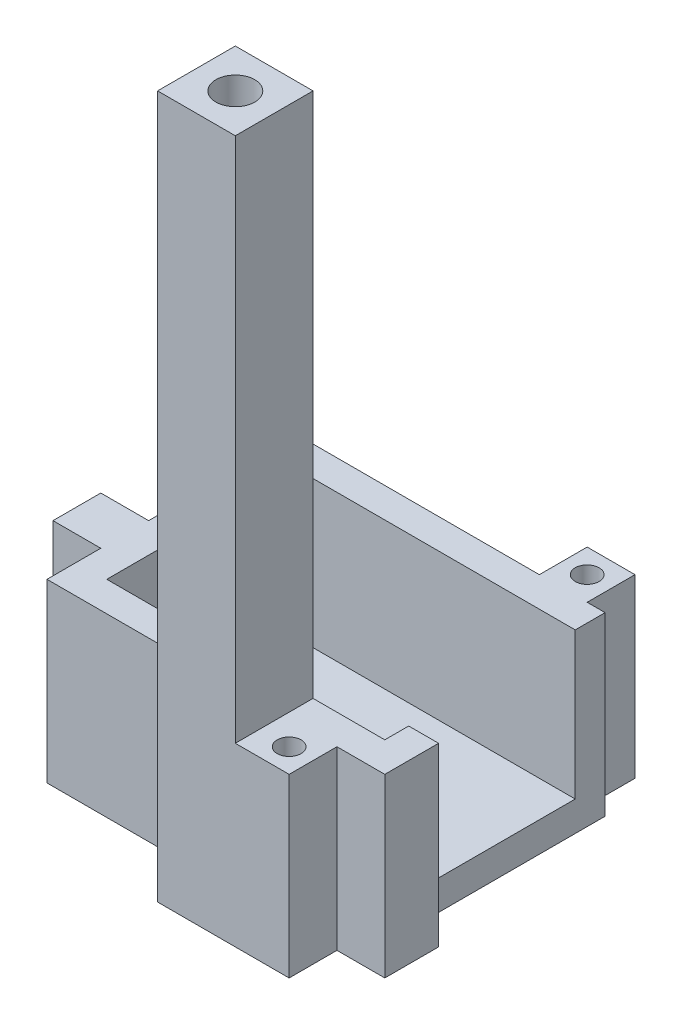
ISO-10303-21;
HEADER;
FILE_DESCRIPTION(('STEP AP214'),'2;1');
FILE_NAME('part.step','',(''),(''),'','','');
FILE_SCHEMA(('AUTOMOTIVE_DESIGN { 1 0 10303 214 1 1 1 1 }'));
ENDSEC;
DATA;
#1=APPLICATION_CONTEXT('core data for automotive mechanical design processes');
#2=APPLICATION_PROTOCOL_DEFINITION('international standard','automotive_design',2000,#1);
#3=PRODUCT_CONTEXT('',#1,'mechanical');
#4=PRODUCT('Part','Part','',(#3));
#5=PRODUCT_RELATED_PRODUCT_CATEGORY('part','',(#4));
#6=PRODUCT_DEFINITION_FORMATION('','',#4);
#7=PRODUCT_DEFINITION_CONTEXT('part definition',#1,'design');
#8=PRODUCT_DEFINITION('design','',#6,#7);
#9=PRODUCT_DEFINITION_SHAPE('','',#8);
#10=(LENGTH_UNIT() NAMED_UNIT(*) SI_UNIT(.MILLI.,.METRE.));
#11=(NAMED_UNIT(*) PLANE_ANGLE_UNIT() SI_UNIT($,.RADIAN.));
#12=(NAMED_UNIT(*) SI_UNIT($,.STERADIAN.) SOLID_ANGLE_UNIT());
#13=UNCERTAINTY_MEASURE_WITH_UNIT(LENGTH_MEASURE(1.E-05),#10,'distance_accuracy_value','');
#14=(GEOMETRIC_REPRESENTATION_CONTEXT(3) GLOBAL_UNCERTAINTY_ASSIGNED_CONTEXT((#13)) GLOBAL_UNIT_ASSIGNED_CONTEXT((#10,
#11,#12)) REPRESENTATION_CONTEXT('',''));
#15=CARTESIAN_POINT('',(0.,0.,0.));
#16=DIRECTION('',(0.,0.,1.));
#17=DIRECTION('',(1.,0.,0.));
#18=AXIS2_PLACEMENT_3D('',#15,#16,#17);
#19=CARTESIAN_POINT('',(0.,24.5,41.85));
#20=DIRECTION('',(1.,0.,0.));
#21=DIRECTION('',(0.,0.,-1.));
#22=AXIS2_PLACEMENT_3D('',#19,#20,#21);
#23=PLANE('',#22);
#24=DIRECTION('',(0.,1.,0.));
#25=VECTOR('',#24,1.);
#26=CARTESIAN_POINT('',(0.,24.5,32.85));
#27=LINE('',#26,#25);
#28=CARTESIAN_POINT('',(0.,-5.,32.85));
#29=VERTEX_POINT('',#28);
#30=CARTESIAN_POINT('',(0.,24.5,32.85));
#31=VERTEX_POINT('',#30);
#32=EDGE_CURVE('E229',#29,#31,#27,.T.);
#33=ORIENTED_EDGE('',*,*,#32,.F.);
#34=DIRECTION('',(0.,0.,-1.));
#35=VECTOR('',#34,1.);
#36=CARTESIAN_POINT('',(0.,-5.,41.85));
#37=LINE('',#36,#35);
#38=CARTESIAN_POINT('',(0.,-5.,41.85));
#39=VERTEX_POINT('',#38);
#40=EDGE_CURVE('E341',#39,#29,#37,.T.);
#41=ORIENTED_EDGE('',*,*,#40,.F.);
#42=DIRECTION('',(0.,-1.,0.));
#43=VECTOR('',#42,1.);
#44=CARTESIAN_POINT('',(0.,24.5,41.85));
#45=LINE('',#44,#43);
#46=CARTESIAN_POINT('',(0.,24.5,41.85));
#47=VERTEX_POINT('',#46);
#48=EDGE_CURVE('E45',#47,#39,#45,.T.);
#49=ORIENTED_EDGE('',*,*,#48,.F.);
#50=DIRECTION('',(0.,0.,1.));
#51=VECTOR('',#50,1.);
#52=CARTESIAN_POINT('',(0.,24.5,41.85));
#53=LINE('',#52,#51);
#54=EDGE_CURVE('E52',#31,#47,#53,.T.);
#55=ORIENTED_EDGE('',*,*,#54,.F.);
#56=EDGE_LOOP('',(#33,#41,#49,#55));
#57=FACE_BOUND('',#56,.T.);
#58=ADVANCED_FACE('F38',(#57),#23,.F.);
#59=DIRECTION('',(0.,-1.,0.));
#60=VECTOR('',#59,1.);
#61=CARTESIAN_POINT('',(0.,24.5,24.85));
#62=LINE('',#61,#60);
#63=CARTESIAN_POINT('',(0.,24.5,24.85));
#64=VERTEX_POINT('',#63);
#65=CARTESIAN_POINT('',(0.,-5.,24.85));
#66=VERTEX_POINT('',#65);
#67=EDGE_CURVE('E60',#64,#66,#62,.T.);
#68=ORIENTED_EDGE('',*,*,#67,.F.);
#69=CARTESIAN_POINT('',(0.,24.5,0.));
#70=VERTEX_POINT('',#69);
#71=EDGE_CURVE('E352',#70,#64,#53,.T.);
#72=ORIENTED_EDGE('',*,*,#71,.F.);
#73=DIRECTION('',(0.,-1.,0.));
#74=VECTOR('',#73,1.);
#75=CARTESIAN_POINT('',(0.,24.5,0.));
#76=LINE('',#75,#74);
#77=CARTESIAN_POINT('',(0.,-5.,0.));
#78=VERTEX_POINT('',#77);
#79=EDGE_CURVE('E377',#70,#78,#76,.T.);
#80=ORIENTED_EDGE('',*,*,#79,.T.);
#81=EDGE_CURVE('E340',#66,#78,#37,.T.);
#82=ORIENTED_EDGE('',*,*,#81,.F.);
#83=EDGE_LOOP('',(#68,#72,#80,#82));
#84=FACE_BOUND('',#83,.T.);
#85=ADVANCED_FACE('F459',(#84),#23,.F.);
#86=CARTESIAN_POINT('',(0.,24.5,0.));
#87=DIRECTION('',(0.,-1.,0.));
#88=DIRECTION('',(0.,0.,-1.));
#89=AXIS2_PLACEMENT_3D('',#86,#87,#88);
#90=PLANE('',#89);
#91=CARTESIAN_POINT('',(44.5,24.5,-4.));
#92=DIRECTION('',(0.,1.,0.));
#93=DIRECTION('',(0.,0.,1.));
#94=AXIS2_PLACEMENT_3D('',#91,#92,#93);
#95=CIRCLE('',#94,2.);
#96=CARTESIAN_POINT('',(44.5,24.5,-2.));
#97=VERTEX_POINT('',#96);
#98=EDGE_CURVE('E284',#97,#97,#95,.T.);
#99=ORIENTED_EDGE('',*,*,#98,.F.);
#100=EDGE_LOOP('',(#99));
#101=FACE_BOUND('',#100,.T.);
#102=DIRECTION('',(0.,0.,1.));
#103=VECTOR('',#102,1.);
#104=CARTESIAN_POINT('',(26.5,24.5,49.85));
#105=LINE('',#104,#103);
#106=CARTESIAN_POINT('',(26.5,24.5,36.85));
#107=VERTEX_POINT('',#106);
#108=CARTESIAN_POINT('',(26.5,24.5,41.85));
#109=VERTEX_POINT('',#108);
#110=EDGE_CURVE('E245',#107,#109,#105,.T.);
#111=ORIENTED_EDGE('',*,*,#110,.F.);
#112=DIRECTION('',(-1.,0.,0.));
#113=VECTOR('',#112,1.);
#114=CARTESIAN_POINT('',(4.99999999999999,24.5,36.85));
#115=LINE('',#114,#113);
#116=CARTESIAN_POINT('',(4.99999999999999,24.5,36.85));
#117=VERTEX_POINT('',#116);
#118=EDGE_CURVE('E364',#107,#117,#115,.T.);
#119=ORIENTED_EDGE('',*,*,#118,.T.);
#120=DIRECTION('',(0.,0.,-1.));
#121=VECTOR('',#120,1.);
#122=CARTESIAN_POINT('',(4.99999999999999,24.5,5.));
#123=LINE('',#122,#121);
#124=CARTESIAN_POINT('',(4.99999999999999,24.5,5.));
#125=VERTEX_POINT('',#124);
#126=EDGE_CURVE('E367',#117,#125,#123,.T.);
#127=ORIENTED_EDGE('',*,*,#126,.T.);
#128=DIRECTION('',(1.,0.,0.));
#129=VECTOR('',#128,1.);
#130=CARTESIAN_POINT('',(51.5,24.5,5.));
#131=LINE('',#130,#129);
#132=CARTESIAN_POINT('',(51.5,24.5,5.));
#133=VERTEX_POINT('',#132);
#134=EDGE_CURVE('E369',#125,#133,#131,.T.);
#135=ORIENTED_EDGE('',*,*,#134,.T.);
#136=DIRECTION('',(0.,0.,-1.));
#137=VECTOR('',#136,1.);
#138=CARTESIAN_POINT('',(51.5,24.5,0.));
#139=LINE('',#138,#137);
#140=CARTESIAN_POINT('',(51.5,24.5,0.));
#141=VERTEX_POINT('',#140);
#142=EDGE_CURVE('E371',#133,#141,#139,.T.);
#143=ORIENTED_EDGE('',*,*,#142,.T.);
#144=DIRECTION('',(-1.,0.,0.));
#145=VECTOR('',#144,1.);
#146=CARTESIAN_POINT('',(0.,24.5,0.));
#147=LINE('',#146,#145);
#148=CARTESIAN_POINT('',(48.5,24.5,0.));
#149=VERTEX_POINT('',#148);
#150=EDGE_CURVE('E374',#141,#149,#147,.T.);
#151=ORIENTED_EDGE('',*,*,#150,.T.);
#152=DIRECTION('',(0.,0.,1.));
#153=VECTOR('',#152,1.);
#154=CARTESIAN_POINT('',(48.5,24.5,-8.));
#155=LINE('',#154,#153);
#156=CARTESIAN_POINT('',(48.5,24.5,-8.));
#157=VERTEX_POINT('',#156);
#158=EDGE_CURVE('E318',#157,#149,#155,.T.);
#159=ORIENTED_EDGE('',*,*,#158,.F.);
#160=DIRECTION('',(1.,0.,0.));
#161=VECTOR('',#160,1.);
#162=CARTESIAN_POINT('',(48.5,24.5,-8.));
#163=LINE('',#162,#161);
#164=CARTESIAN_POINT('',(40.5,24.5,-8.));
#165=VERTEX_POINT('',#164);
#166=EDGE_CURVE('E316',#165,#157,#163,.T.);
#167=ORIENTED_EDGE('',*,*,#166,.F.);
#168=DIRECTION('',(0.,0.,1.));
#169=VECTOR('',#168,1.);
#170=CARTESIAN_POINT('',(40.5,24.5,-8.));
#171=LINE('',#170,#169);
#172=CARTESIAN_POINT('',(40.5,24.5,0.));
#173=VERTEX_POINT('',#172);
#174=EDGE_CURVE('E322',#165,#173,#171,.T.);
#175=ORIENTED_EDGE('',*,*,#174,.T.);
#176=EDGE_CURVE('E373',#173,#70,#147,.T.);
#177=ORIENTED_EDGE('',*,*,#176,.T.);
#178=ORIENTED_EDGE('',*,*,#71,.T.);
#179=DIRECTION('',(1.,0.,0.));
#180=VECTOR('',#179,1.);
#181=CARTESIAN_POINT('',(-8.,24.5,24.85));
#182=LINE('',#181,#180);
#183=CARTESIAN_POINT('',(-8.,24.5,24.85));
#184=VERTEX_POINT('',#183);
#185=EDGE_CURVE('E214',#184,#64,#182,.T.);
#186=ORIENTED_EDGE('',*,*,#185,.F.);
#187=DIRECTION('',(0.,0.,-1.));
#188=VECTOR('',#187,1.);
#189=CARTESIAN_POINT('',(-8.,24.5,32.85));
#190=LINE('',#189,#188);
#191=CARTESIAN_POINT('',(-8.,24.5,32.85));
#192=VERTEX_POINT('',#191);
#193=EDGE_CURVE('E207',#192,#184,#190,.T.);
#194=ORIENTED_EDGE('',*,*,#193,.F.);
#195=DIRECTION('',(1.,0.,0.));
#196=VECTOR('',#195,1.);
#197=CARTESIAN_POINT('',(-8.,24.5,32.85));
#198=LINE('',#197,#196);
#199=EDGE_CURVE('E211',#192,#31,#198,.T.);
#200=ORIENTED_EDGE('',*,*,#199,.T.);
#201=ORIENTED_EDGE('',*,*,#54,.T.);
#202=DIRECTION('',(1.,0.,0.));
#203=VECTOR('',#202,1.);
#204=CARTESIAN_POINT('',(56.5,24.5,41.85));
#205=LINE('',#204,#203);
#206=EDGE_CURVE('E355',#47,#109,#205,.T.);
#207=ORIENTED_EDGE('',*,*,#206,.T.);
#208=EDGE_LOOP('',(#111,#119,#127,#135,#143,#151,#159,#167,#175,#177,#178,#186,#194,#200,#201,#207));
#209=FACE_BOUND('',#208,.T.);
#210=ADVANCED_FACE('F209',(#101,#209),#90,.F.);
#211=CARTESIAN_POINT('',(44.5,24.5,45.85));
#212=DIRECTION('',(0.,1.,0.));
#213=DIRECTION('',(0.,0.,1.));
#214=AXIS2_PLACEMENT_3D('',#211,#212,#213);
#215=CIRCLE('',#214,2.);
#216=CARTESIAN_POINT('',(44.5,24.5,47.85));
#217=VERTEX_POINT('',#216);
#218=EDGE_CURVE('E287',#217,#217,#215,.T.);
#219=ORIENTED_EDGE('',*,*,#218,.F.);
#220=EDGE_LOOP('',(#219));
#221=FACE_BOUND('',#220,.T.);
#222=DIRECTION('',(0.,0.,-1.));
#223=VECTOR('',#222,1.);
#224=CARTESIAN_POINT('',(39.5,24.5,49.85));
#225=LINE('',#224,#223);
#226=CARTESIAN_POINT('',(39.5,24.5,49.85));
#227=VERTEX_POINT('',#226);
#228=CARTESIAN_POINT('',(39.5,24.5,36.85));
#229=VERTEX_POINT('',#228);
#230=EDGE_CURVE('E252',#227,#229,#225,.T.);
#231=ORIENTED_EDGE('',*,*,#230,.F.);
#232=DIRECTION('',(-1.,0.,0.));
#233=VECTOR('',#232,1.);
#234=CARTESIAN_POINT('',(48.5,24.5,49.85));
#235=LINE('',#234,#233);
#236=CARTESIAN_POINT('',(48.5,24.5,49.85));
#237=VERTEX_POINT('',#236);
#238=EDGE_CURVE('E295',#237,#227,#235,.T.);
#239=ORIENTED_EDGE('',*,*,#238,.F.);
#240=DIRECTION('',(0.,0.,-1.));
#241=VECTOR('',#240,1.);
#242=CARTESIAN_POINT('',(48.5,24.5,49.85));
#243=LINE('',#242,#241);
#244=CARTESIAN_POINT('',(48.5,24.5,41.85));
#245=VERTEX_POINT('',#244);
#246=EDGE_CURVE('E305',#237,#245,#243,.T.);
#247=ORIENTED_EDGE('',*,*,#246,.T.);
#248=CARTESIAN_POINT('',(56.5,24.5,41.85));
#249=VERTEX_POINT('',#248);
#250=EDGE_CURVE('E354',#245,#249,#205,.T.);
#251=ORIENTED_EDGE('',*,*,#250,.T.);
#252=DIRECTION('',(0.,0.,-1.));
#253=VECTOR('',#252,1.);
#254=CARTESIAN_POINT('',(56.5,24.5,32.85));
#255=LINE('',#254,#253);
#256=CARTESIAN_POINT('',(56.5,24.5,32.85));
#257=VERTEX_POINT('',#256);
#258=EDGE_CURVE('E358',#249,#257,#255,.T.);
#259=ORIENTED_EDGE('',*,*,#258,.T.);
#260=DIRECTION('',(-1.,0.,0.));
#261=VECTOR('',#260,1.);
#262=CARTESIAN_POINT('',(51.5,24.5,32.85));
#263=LINE('',#262,#261);
#264=CARTESIAN_POINT('',(51.5,24.5,32.85));
#265=VERTEX_POINT('',#264);
#266=EDGE_CURVE('E360',#257,#265,#263,.T.);
#267=ORIENTED_EDGE('',*,*,#266,.T.);
#268=DIRECTION('',(0.,0.,1.));
#269=VECTOR('',#268,1.);
#270=CARTESIAN_POINT('',(51.5,24.5,36.85));
#271=LINE('',#270,#269);
#272=CARTESIAN_POINT('',(51.5,24.5,36.85));
#273=VERTEX_POINT('',#272);
#274=EDGE_CURVE('E362',#265,#273,#271,.T.);
#275=ORIENTED_EDGE('',*,*,#274,.T.);
#276=EDGE_CURVE('E365',#273,#229,#115,.T.);
#277=ORIENTED_EDGE('',*,*,#276,.T.);
#278=EDGE_LOOP('',(#231,#239,#247,#251,#259,#267,#275,#277));
#279=FACE_BOUND('',#278,.T.);
#280=ADVANCED_FACE('F466',(#221,#279),#90,.F.);
#281=CARTESIAN_POINT('',(56.5,24.5,41.85));
#282=DIRECTION('',(0.,0.,-1.));
#283=DIRECTION('',(-1.,0.,0.));
#284=AXIS2_PLACEMENT_3D('',#281,#282,#283);
#285=PLANE('',#284);
#286=DIRECTION('',(-1.,0.,0.));
#287=VECTOR('',#286,1.);
#288=CARTESIAN_POINT('',(0.,-5.,41.85));
#289=LINE('',#288,#287);
#290=CARTESIAN_POINT('',(56.5,-5.,41.85));
#291=VERTEX_POINT('',#290);
#292=CARTESIAN_POINT('',(48.5,-5.,41.85));
#293=VERTEX_POINT('',#292);
#294=EDGE_CURVE('E349',#291,#293,#289,.T.);
#295=ORIENTED_EDGE('',*,*,#294,.F.);
#296=DIRECTION('',(0.,-1.,0.));
#297=VECTOR('',#296,1.);
#298=CARTESIAN_POINT('',(56.5,24.5,41.85));
#299=LINE('',#298,#297);
#300=EDGE_CURVE('E410',#249,#291,#299,.T.);
#301=ORIENTED_EDGE('',*,*,#300,.F.);
#302=ORIENTED_EDGE('',*,*,#250,.F.);
#303=DIRECTION('',(0.,1.,0.));
#304=VECTOR('',#303,1.);
#305=CARTESIAN_POINT('',(48.5,24.5,41.85));
#306=LINE('',#305,#304);
#307=EDGE_CURVE('E283',#293,#245,#306,.T.);
#308=ORIENTED_EDGE('',*,*,#307,.F.);
#309=EDGE_LOOP('',(#295,#301,#302,#308));
#310=FACE_BOUND('',#309,.T.);
#311=ADVANCED_FACE('F472',(#310),#285,.F.);
#312=CARTESIAN_POINT('',(26.5,-4.99999999999999,41.85));
#313=VERTEX_POINT('',#312);
#314=EDGE_CURVE('E348',#313,#39,#289,.T.);
#315=ORIENTED_EDGE('',*,*,#314,.F.);
#316=DIRECTION('',(0.,-1.,0.));
#317=VECTOR('',#316,1.);
#318=CARTESIAN_POINT('',(26.5,24.5,41.85));
#319=LINE('',#318,#317);
#320=EDGE_CURVE('E271',#109,#313,#319,.T.);
#321=ORIENTED_EDGE('',*,*,#320,.F.);
#322=ORIENTED_EDGE('',*,*,#206,.F.);
#323=ORIENTED_EDGE('',*,*,#48,.T.);
#324=EDGE_LOOP('',(#315,#321,#322,#323));
#325=FACE_BOUND('',#324,.T.);
#326=ADVANCED_FACE('F416',(#325),#285,.F.);
#327=CARTESIAN_POINT('',(0.,24.5,0.));
#328=DIRECTION('',(0.,0.,1.));
#329=DIRECTION('',(1.,0.,0.));
#330=AXIS2_PLACEMENT_3D('',#327,#328,#329);
#331=PLANE('',#330);
#332=DIRECTION('',(0.,-1.,0.));
#333=VECTOR('',#332,1.);
#334=CARTESIAN_POINT('',(51.5,24.5,0.));
#335=LINE('',#334,#333);
#336=CARTESIAN_POINT('',(51.5,-5.,0.));
#337=VERTEX_POINT('',#336);
#338=EDGE_CURVE('E391',#141,#337,#335,.T.);
#339=ORIENTED_EDGE('',*,*,#338,.T.);
#340=DIRECTION('',(1.,0.,0.));
#341=VECTOR('',#340,1.);
#342=CARTESIAN_POINT('',(0.,-5.,0.));
#343=LINE('',#342,#341);
#344=CARTESIAN_POINT('',(48.5,-5.,0.));
#345=VERTEX_POINT('',#344);
#346=EDGE_CURVE('E344',#345,#337,#343,.T.);
#347=ORIENTED_EDGE('',*,*,#346,.F.);
#348=DIRECTION('',(0.,-1.,0.));
#349=VECTOR('',#348,1.);
#350=CARTESIAN_POINT('',(48.5,24.5,0.));
#351=LINE('',#350,#349);
#352=EDGE_CURVE('E307',#149,#345,#351,.T.);
#353=ORIENTED_EDGE('',*,*,#352,.F.);
#354=ORIENTED_EDGE('',*,*,#150,.F.);
#355=EDGE_LOOP('',(#339,#347,#353,#354));
#356=FACE_BOUND('',#355,.T.);
#357=ADVANCED_FACE('F477',(#356),#331,.F.);
#358=DIRECTION('',(0.,1.,0.));
#359=VECTOR('',#358,1.);
#360=CARTESIAN_POINT('',(40.5,24.5,0.));
#361=LINE('',#360,#359);
#362=CARTESIAN_POINT('',(40.5,-5.,0.));
#363=VERTEX_POINT('',#362);
#364=EDGE_CURVE('E312',#363,#173,#361,.T.);
#365=ORIENTED_EDGE('',*,*,#364,.F.);
#366=EDGE_CURVE('E345',#78,#363,#343,.T.);
#367=ORIENTED_EDGE('',*,*,#366,.F.);
#368=ORIENTED_EDGE('',*,*,#79,.F.);
#369=ORIENTED_EDGE('',*,*,#176,.F.);
#370=EDGE_LOOP('',(#365,#367,#368,#369));
#371=FACE_BOUND('',#370,.T.);
#372=ADVANCED_FACE('F479',(#371),#331,.F.);
#373=CARTESIAN_POINT('',(0.,0.,0.));
#374=DIRECTION('',(0.,-1.,0.));
#375=DIRECTION('',(0.,0.,-1.));
#376=AXIS2_PLACEMENT_3D('',#373,#374,#375);
#377=PLANE('',#376);
#378=DIRECTION('',(0.,0.,1.));
#379=VECTOR('',#378,1.);
#380=CARTESIAN_POINT('',(51.5,0.,36.85));
#381=LINE('',#380,#379);
#382=CARTESIAN_POINT('',(51.5,0.,32.85));
#383=VERTEX_POINT('',#382);
#384=CARTESIAN_POINT('',(51.5,0.,36.85));
#385=VERTEX_POINT('',#384);
#386=EDGE_CURVE('E351',#383,#385,#381,.T.);
#387=ORIENTED_EDGE('',*,*,#386,.F.);
#388=DIRECTION('',(0.,0.,1.));
#389=VECTOR('',#388,1.);
#390=CARTESIAN_POINT('',(51.5,0.,5.));
#391=LINE('',#390,#389);
#392=CARTESIAN_POINT('',(51.5,0.,5.));
#393=VERTEX_POINT('',#392);
#394=EDGE_CURVE('E330',#393,#383,#391,.T.);
#395=ORIENTED_EDGE('',*,*,#394,.F.);
#396=DIRECTION('',(1.,0.,0.));
#397=VECTOR('',#396,1.);
#398=CARTESIAN_POINT('',(51.5,0.,5.));
#399=LINE('',#398,#397);
#400=CARTESIAN_POINT('',(4.99999999999999,0.,5.));
#401=VERTEX_POINT('',#400);
#402=EDGE_CURVE('E386',#401,#393,#399,.T.);
#403=ORIENTED_EDGE('',*,*,#402,.F.);
#404=DIRECTION('',(0.,0.,-1.));
#405=VECTOR('',#404,1.);
#406=CARTESIAN_POINT('',(4.99999999999999,0.,5.));
#407=LINE('',#406,#405);
#408=CARTESIAN_POINT('',(4.99999999999999,0.,36.85));
#409=VERTEX_POINT('',#408);
#410=EDGE_CURVE('E383',#409,#401,#407,.T.);
#411=ORIENTED_EDGE('',*,*,#410,.F.);
#412=DIRECTION('',(-1.,0.,0.));
#413=VECTOR('',#412,1.);
#414=CARTESIAN_POINT('',(4.99999999999999,0.,36.85));
#415=LINE('',#414,#413);
#416=EDGE_CURVE('E380',#385,#409,#415,.T.);
#417=ORIENTED_EDGE('',*,*,#416,.F.);
#418=EDGE_LOOP('',(#387,#395,#403,#411,#417));
#419=FACE_BOUND('',#418,.T.);
#420=ADVANCED_FACE('F476',(#419),#377,.F.);
#421=CARTESIAN_POINT('',(56.5,24.5,32.85));
#422=DIRECTION('',(-1.,0.,0.));
#423=DIRECTION('',(0.,0.,1.));
#424=AXIS2_PLACEMENT_3D('',#421,#422,#423);
#425=PLANE('',#424);
#426=ORIENTED_EDGE('',*,*,#300,.T.);
#427=DIRECTION('',(0.,0.,-1.));
#428=VECTOR('',#427,1.);
#429=CARTESIAN_POINT('',(56.5,-5.,0.));
#430=LINE('',#429,#428);
#431=CARTESIAN_POINT('',(56.5,-5.00000000000001,32.85));
#432=VERTEX_POINT('',#431);
#433=EDGE_CURVE('E11',#291,#432,#430,.T.);
#434=ORIENTED_EDGE('',*,*,#433,.T.);
#435=DIRECTION('',(0.,-1.,0.));
#436=VECTOR('',#435,1.);
#437=CARTESIAN_POINT('',(56.5,24.5,32.85));
#438=LINE('',#437,#436);
#439=EDGE_CURVE('E408',#257,#432,#438,.T.);
#440=ORIENTED_EDGE('',*,*,#439,.F.);
#441=ORIENTED_EDGE('',*,*,#258,.F.);
#442=EDGE_LOOP('',(#426,#434,#440,#441));
#443=FACE_BOUND('',#442,.T.);
#444=ADVANCED_FACE('F500',(#443),#425,.F.);
#445=CARTESIAN_POINT('',(51.5,24.5,32.85));
#446=DIRECTION('',(0.,0.,1.));
#447=DIRECTION('',(1.,0.,0.));
#448=AXIS2_PLACEMENT_3D('',#445,#446,#447);
#449=PLANE('',#448);
#450=ORIENTED_EDGE('',*,*,#439,.T.);
#451=DIRECTION('',(-1.,0.,0.));
#452=VECTOR('',#451,1.);
#453=CARTESIAN_POINT('',(0.,-5.,32.85));
#454=LINE('',#453,#452);
#455=CARTESIAN_POINT('',(51.5,-5.,32.85));
#456=VERTEX_POINT('',#455);
#457=EDGE_CURVE('E335',#432,#456,#454,.T.);
#458=ORIENTED_EDGE('',*,*,#457,.T.);
#459=DIRECTION('',(0.,1.,0.));
#460=VECTOR('',#459,1.);
#461=CARTESIAN_POINT('',(51.5,-26.,32.85));
#462=LINE('',#461,#460);
#463=EDGE_CURVE('E332',#456,#383,#462,.T.);
#464=ORIENTED_EDGE('',*,*,#463,.T.);
#465=DIRECTION('',(0.,-1.,0.));
#466=VECTOR('',#465,1.);
#467=CARTESIAN_POINT('',(51.5,24.5,32.85));
#468=LINE('',#467,#466);
#469=EDGE_CURVE('E405',#265,#383,#468,.T.);
#470=ORIENTED_EDGE('',*,*,#469,.F.);
#471=ORIENTED_EDGE('',*,*,#266,.F.);
#472=EDGE_LOOP('',(#450,#458,#464,#470,#471));
#473=FACE_BOUND('',#472,.T.);
#474=ADVANCED_FACE('F496',(#473),#449,.F.);
#475=CARTESIAN_POINT('',(51.5,24.5,36.85));
#476=DIRECTION('',(1.,0.,0.));
#477=DIRECTION('',(0.,0.,-1.));
#478=AXIS2_PLACEMENT_3D('',#475,#476,#477);
#479=PLANE('',#478);
#480=ORIENTED_EDGE('',*,*,#386,.T.);
#481=DIRECTION('',(0.,-1.,0.));
#482=VECTOR('',#481,1.);
#483=CARTESIAN_POINT('',(51.5,24.5,36.85));
#484=LINE('',#483,#482);
#485=EDGE_CURVE('E402',#273,#385,#484,.T.);
#486=ORIENTED_EDGE('',*,*,#485,.F.);
#487=ORIENTED_EDGE('',*,*,#274,.F.);
#488=ORIENTED_EDGE('',*,*,#469,.T.);
#489=EDGE_LOOP('',(#480,#486,#487,#488));
#490=FACE_BOUND('',#489,.T.);
#491=ADVANCED_FACE('F492',(#490),#479,.F.);
#492=CARTESIAN_POINT('',(4.99999999999999,24.5,36.85));
#493=DIRECTION('',(0.,0.,1.));
#494=DIRECTION('',(1.,0.,0.));
#495=AXIS2_PLACEMENT_3D('',#492,#493,#494);
#496=PLANE('',#495);
#497=ORIENTED_EDGE('',*,*,#416,.T.);
#498=DIRECTION('',(0.,-1.,0.));
#499=VECTOR('',#498,1.);
#500=CARTESIAN_POINT('',(4.99999999999999,24.5,36.85));
#501=LINE('',#500,#499);
#502=EDGE_CURVE('E399',#117,#409,#501,.T.);
#503=ORIENTED_EDGE('',*,*,#502,.F.);
#504=ORIENTED_EDGE('',*,*,#118,.F.);
#505=DIRECTION('',(0.,-1.,0.));
#506=VECTOR('',#505,1.);
#507=CARTESIAN_POINT('',(26.5,112.5,36.85));
#508=LINE('',#507,#506);
#509=CARTESIAN_POINT('',(26.5,112.5,36.85));
#510=VERTEX_POINT('',#509);
#511=EDGE_CURVE('E258',#510,#107,#508,.T.);
#512=ORIENTED_EDGE('',*,*,#511,.F.);
#513=DIRECTION('',(-1.,0.,0.));
#514=VECTOR('',#513,1.);
#515=CARTESIAN_POINT('',(26.5,112.5,36.85));
#516=LINE('',#515,#514);
#517=CARTESIAN_POINT('',(39.5,112.5,36.85));
#518=VERTEX_POINT('',#517);
#519=EDGE_CURVE('E256',#518,#510,#516,.T.);
#520=ORIENTED_EDGE('',*,*,#519,.F.);
#521=DIRECTION('',(0.,-1.,0.));
#522=VECTOR('',#521,1.);
#523=CARTESIAN_POINT('',(39.5,112.5,36.85));
#524=LINE('',#523,#522);
#525=EDGE_CURVE('E265',#518,#229,#524,.T.);
#526=ORIENTED_EDGE('',*,*,#525,.T.);
#527=ORIENTED_EDGE('',*,*,#276,.F.);
#528=ORIENTED_EDGE('',*,*,#485,.T.);
#529=EDGE_LOOP('',(#497,#503,#504,#512,#520,#526,#527,#528));
#530=FACE_BOUND('',#529,.T.);
#531=ADVANCED_FACE('F488',(#530),#496,.F.);
#532=CARTESIAN_POINT('',(4.99999999999999,24.5,5.));
#533=DIRECTION('',(-1.,0.,0.));
#534=DIRECTION('',(0.,0.,1.));
#535=AXIS2_PLACEMENT_3D('',#532,#533,#534);
#536=PLANE('',#535);
#537=ORIENTED_EDGE('',*,*,#410,.T.);
#538=DIRECTION('',(0.,-1.,0.));
#539=VECTOR('',#538,1.);
#540=CARTESIAN_POINT('',(4.99999999999999,24.5,5.));
#541=LINE('',#540,#539);
#542=EDGE_CURVE('E396',#125,#401,#541,.T.);
#543=ORIENTED_EDGE('',*,*,#542,.F.);
#544=ORIENTED_EDGE('',*,*,#126,.F.);
#545=ORIENTED_EDGE('',*,*,#502,.T.);
#546=EDGE_LOOP('',(#537,#543,#544,#545));
#547=FACE_BOUND('',#546,.T.);
#548=ADVANCED_FACE('F484',(#547),#536,.F.);
#549=CARTESIAN_POINT('',(51.5,24.5,5.));
#550=DIRECTION('',(0.,0.,-1.));
#551=DIRECTION('',(-1.,0.,0.));
#552=AXIS2_PLACEMENT_3D('',#549,#550,#551);
#553=PLANE('',#552);
#554=ORIENTED_EDGE('',*,*,#402,.T.);
#555=DIRECTION('',(0.,-1.,0.));
#556=VECTOR('',#555,1.);
#557=CARTESIAN_POINT('',(51.5,24.5,5.));
#558=LINE('',#557,#556);
#559=EDGE_CURVE('E393',#133,#393,#558,.T.);
#560=ORIENTED_EDGE('',*,*,#559,.F.);
#561=ORIENTED_EDGE('',*,*,#134,.F.);
#562=ORIENTED_EDGE('',*,*,#542,.T.);
#563=EDGE_LOOP('',(#554,#560,#561,#562));
#564=FACE_BOUND('',#563,.T.);
#565=ADVANCED_FACE('F454',(#564),#553,.F.);
#566=CARTESIAN_POINT('',(51.5,24.5,0.));
#567=DIRECTION('',(-1.,0.,0.));
#568=DIRECTION('',(0.,0.,1.));
#569=AXIS2_PLACEMENT_3D('',#566,#567,#568);
#570=PLANE('',#569);
#571=ORIENTED_EDGE('',*,*,#559,.T.);
#572=ORIENTED_EDGE('',*,*,#394,.T.);
#573=ORIENTED_EDGE('',*,*,#463,.F.);
#574=DIRECTION('',(0.,0.,-1.));
#575=VECTOR('',#574,1.);
#576=CARTESIAN_POINT('',(51.5,-5.,0.));
#577=LINE('',#576,#575);
#578=EDGE_CURVE('E337',#456,#337,#577,.T.);
#579=ORIENTED_EDGE('',*,*,#578,.T.);
#580=ORIENTED_EDGE('',*,*,#338,.F.);
#581=ORIENTED_EDGE('',*,*,#142,.F.);
#582=EDGE_LOOP('',(#571,#572,#573,#579,#580,#581));
#583=FACE_BOUND('',#582,.T.);
#584=ADVANCED_FACE('F445',(#583),#570,.F.);
#585=CARTESIAN_POINT('',(0.,-5.,0.));
#586=DIRECTION('',(0.,-1.,0.));
#587=DIRECTION('',(0.,0.,-1.));
#588=AXIS2_PLACEMENT_3D('',#585,#586,#587);
#589=PLANE('',#588);
#590=CARTESIAN_POINT('',(-4.,-5.,28.85));
#591=DIRECTION('',(0.,-1.,0.));
#592=DIRECTION('',(0.,0.,-1.));
#593=AXIS2_PLACEMENT_3D('',#590,#591,#592);
#594=CIRCLE('',#593,2.5);
#595=CARTESIAN_POINT('',(-4.,-5.,26.35));
#596=VERTEX_POINT('',#595);
#597=EDGE_CURVE('E429',#596,#596,#594,.T.);
#598=ORIENTED_EDGE('',*,*,#597,.F.);
#599=EDGE_LOOP('',(#598));
#600=FACE_BOUND('',#599,.T.);
#601=ORIENTED_EDGE('',*,*,#314,.T.);
#602=ORIENTED_EDGE('',*,*,#40,.T.);
#603=DIRECTION('',(1.,0.,0.));
#604=VECTOR('',#603,1.);
#605=CARTESIAN_POINT('',(-8.,-5.,32.85));
#606=LINE('',#605,#604);
#607=CARTESIAN_POINT('',(-8.,-5.,32.85));
#608=VERTEX_POINT('',#607);
#609=EDGE_CURVE('E420',#608,#29,#606,.T.);
#610=ORIENTED_EDGE('',*,*,#609,.F.);
#611=DIRECTION('',(0.,0.,1.));
#612=VECTOR('',#611,1.);
#613=CARTESIAN_POINT('',(-8.,-5.,32.85));
#614=LINE('',#613,#612);
#615=CARTESIAN_POINT('',(-8.,-5.,24.85));
#616=VERTEX_POINT('',#615);
#617=EDGE_CURVE('E223',#616,#608,#614,.T.);
#618=ORIENTED_EDGE('',*,*,#617,.F.);
#619=DIRECTION('',(1.,0.,0.));
#620=VECTOR('',#619,1.);
#621=CARTESIAN_POINT('',(-8.,-5.,24.85));
#622=LINE('',#621,#620);
#623=EDGE_CURVE('E235',#616,#66,#622,.T.);
#624=ORIENTED_EDGE('',*,*,#623,.T.);
#625=ORIENTED_EDGE('',*,*,#81,.T.);
#626=ORIENTED_EDGE('',*,*,#366,.T.);
#627=DIRECTION('',(0.,0.,1.));
#628=VECTOR('',#627,1.);
#629=CARTESIAN_POINT('',(40.5,-5.,-8.));
#630=LINE('',#629,#628);
#631=CARTESIAN_POINT('',(40.5,-5.,-8.));
#632=VERTEX_POINT('',#631);
#633=EDGE_CURVE('E325',#632,#363,#630,.T.);
#634=ORIENTED_EDGE('',*,*,#633,.F.);
#635=DIRECTION('',(-1.,0.,0.));
#636=VECTOR('',#635,1.);
#637=CARTESIAN_POINT('',(48.5,-5.,-8.));
#638=LINE('',#637,#636);
#639=CARTESIAN_POINT('',(48.5,-5.,-8.));
#640=VERTEX_POINT('',#639);
#641=EDGE_CURVE('E311',#640,#632,#638,.T.);
#642=ORIENTED_EDGE('',*,*,#641,.F.);
#643=DIRECTION('',(0.,0.,1.));
#644=VECTOR('',#643,1.);
#645=CARTESIAN_POINT('',(48.5,-5.,-8.));
#646=LINE('',#645,#644);
#647=EDGE_CURVE('E327',#640,#345,#646,.T.);
#648=ORIENTED_EDGE('',*,*,#647,.T.);
#649=ORIENTED_EDGE('',*,*,#346,.T.);
#650=ORIENTED_EDGE('',*,*,#578,.F.);
#651=ORIENTED_EDGE('',*,*,#457,.F.);
#652=ORIENTED_EDGE('',*,*,#433,.F.);
#653=ORIENTED_EDGE('',*,*,#294,.T.);
#654=DIRECTION('',(0.,0.,-1.));
#655=VECTOR('',#654,1.);
#656=CARTESIAN_POINT('',(48.5,-5.,49.85));
#657=LINE('',#656,#655);
#658=CARTESIAN_POINT('',(48.5,-5.,49.85));
#659=VERTEX_POINT('',#658);
#660=EDGE_CURVE('E300',#659,#293,#657,.T.);
#661=ORIENTED_EDGE('',*,*,#660,.F.);
#662=DIRECTION('',(1.,0.,0.));
#663=VECTOR('',#662,1.);
#664=CARTESIAN_POINT('',(48.5,-5.,49.85));
#665=LINE('',#664,#663);
#666=CARTESIAN_POINT('',(26.5,-4.99999999999999,49.85));
#667=VERTEX_POINT('',#666);
#668=EDGE_CURVE('E298',#667,#659,#665,.T.);
#669=ORIENTED_EDGE('',*,*,#668,.F.);
#670=DIRECTION('',(0.,0.,1.));
#671=VECTOR('',#670,1.);
#672=CARTESIAN_POINT('',(26.5,-4.99999999999999,41.85));
#673=LINE('',#672,#671);
#674=EDGE_CURVE('E274',#313,#667,#673,.T.);
#675=ORIENTED_EDGE('',*,*,#674,.F.);
#676=EDGE_LOOP('',(#601,#602,#610,#618,#624,#625,#626,#634,#642,#648,#649,#650,#651,#652,#653,
#661,#669,#675));
#677=FACE_BOUND('',#676,.T.);
#678=CARTESIAN_POINT('',(33.,-5.,43.35));
#679=DIRECTION('',(0.,-1.,0.));
#680=DIRECTION('',(0.,0.,-1.));
#681=AXIS2_PLACEMENT_3D('',#678,#679,#680);
#682=CIRCLE('',#681,3.25);
#683=CARTESIAN_POINT('',(33.,-5.,40.1));
#684=VERTEX_POINT('',#683);
#685=EDGE_CURVE('E233',#684,#684,#682,.F.);
#686=ORIENTED_EDGE('',*,*,#685,.T.);
#687=EDGE_LOOP('',(#686));
#688=FACE_BOUND('',#687,.T.);
#689=CARTESIAN_POINT('',(44.5,-5.,-4.));
#690=DIRECTION('',(0.,-1.,0.));
#691=DIRECTION('',(0.,0.,-1.));
#692=AXIS2_PLACEMENT_3D('',#689,#690,#691);
#693=CIRCLE('',#692,2.5);
#694=CARTESIAN_POINT('',(44.5,-5.,-6.5));
#695=VERTEX_POINT('',#694);
#696=EDGE_CURVE('E241',#695,#695,#693,.T.);
#697=ORIENTED_EDGE('',*,*,#696,.F.);
#698=EDGE_LOOP('',(#697));
#699=FACE_BOUND('',#698,.T.);
#700=ADVANCED_FACE('F418',(#600,#677,#688,#699),#589,.T.);
#701=CARTESIAN_POINT('',(48.5,24.5,-8.));
#702=DIRECTION('',(-1.,0.,0.));
#703=DIRECTION('',(0.,-1.,0.));
#704=AXIS2_PLACEMENT_3D('',#701,#702,#703);
#705=PLANE('',#704);
#706=ORIENTED_EDGE('',*,*,#352,.T.);
#707=ORIENTED_EDGE('',*,*,#647,.F.);
#708=DIRECTION('',(0.,-1.,0.));
#709=VECTOR('',#708,1.);
#710=CARTESIAN_POINT('',(48.5,24.5,-8.));
#711=LINE('',#710,#709);
#712=EDGE_CURVE('E308',#157,#640,#711,.T.);
#713=ORIENTED_EDGE('',*,*,#712,.F.);
#714=ORIENTED_EDGE('',*,*,#158,.T.);
#715=EDGE_LOOP('',(#706,#707,#713,#714));
#716=FACE_BOUND('',#715,.T.);
#717=ADVANCED_FACE('F444',(#716),#705,.F.);
#718=CARTESIAN_POINT('',(40.5,24.5,-8.));
#719=DIRECTION('',(1.,0.,0.));
#720=DIRECTION('',(0.,0.,-1.));
#721=AXIS2_PLACEMENT_3D('',#718,#719,#720);
#722=PLANE('',#721);
#723=ORIENTED_EDGE('',*,*,#364,.T.);
#724=ORIENTED_EDGE('',*,*,#174,.F.);
#725=DIRECTION('',(0.,1.,0.));
#726=VECTOR('',#725,1.);
#727=CARTESIAN_POINT('',(40.5,24.5,-8.));
#728=LINE('',#727,#726);
#729=EDGE_CURVE('E314',#632,#165,#728,.T.);
#730=ORIENTED_EDGE('',*,*,#729,.F.);
#731=ORIENTED_EDGE('',*,*,#633,.T.);
#732=EDGE_LOOP('',(#723,#724,#730,#731));
#733=FACE_BOUND('',#732,.T.);
#734=ADVANCED_FACE('F451',(#733),#722,.F.);
#735=CARTESIAN_POINT('',(0.,0.,-8.));
#736=DIRECTION('',(0.,0.,-1.));
#737=DIRECTION('',(-1.,0.,0.));
#738=AXIS2_PLACEMENT_3D('',#735,#736,#737);
#739=PLANE('',#738);
#740=ORIENTED_EDGE('',*,*,#712,.T.);
#741=ORIENTED_EDGE('',*,*,#641,.T.);
#742=ORIENTED_EDGE('',*,*,#729,.T.);
#743=ORIENTED_EDGE('',*,*,#166,.T.);
#744=EDGE_LOOP('',(#740,#741,#742,#743));
#745=FACE_BOUND('',#744,.T.);
#746=ADVANCED_FACE('F564',(#745),#739,.T.);
#747=CARTESIAN_POINT('',(48.5,24.5,49.85));
#748=DIRECTION('',(-1.,0.,0.));
#749=DIRECTION('',(0.,0.,1.));
#750=AXIS2_PLACEMENT_3D('',#747,#748,#749);
#751=PLANE('',#750);
#752=ORIENTED_EDGE('',*,*,#307,.T.);
#753=ORIENTED_EDGE('',*,*,#246,.F.);
#754=DIRECTION('',(0.,1.,0.));
#755=VECTOR('',#754,1.);
#756=CARTESIAN_POINT('',(48.5,24.5,49.85));
#757=LINE('',#756,#755);
#758=EDGE_CURVE('E292',#659,#237,#757,.T.);
#759=ORIENTED_EDGE('',*,*,#758,.F.);
#760=ORIENTED_EDGE('',*,*,#660,.T.);
#761=EDGE_LOOP('',(#752,#753,#759,#760));
#762=FACE_BOUND('',#761,.T.);
#763=ADVANCED_FACE('F519',(#762),#751,.F.);
#764=CARTESIAN_POINT('',(0.,0.,49.85));
#765=DIRECTION('',(0.,0.,-1.));
#766=DIRECTION('',(-1.,0.,0.));
#767=AXIS2_PLACEMENT_3D('',#764,#765,#766);
#768=PLANE('',#767);
#769=ORIENTED_EDGE('',*,*,#758,.T.);
#770=ORIENTED_EDGE('',*,*,#238,.T.);
#771=DIRECTION('',(0.,-1.,0.));
#772=VECTOR('',#771,1.);
#773=CARTESIAN_POINT('',(39.5,112.5,49.85));
#774=LINE('',#773,#772);
#775=CARTESIAN_POINT('',(39.5,112.5,49.85));
#776=VERTEX_POINT('',#775);
#777=EDGE_CURVE('E268',#776,#227,#774,.T.);
#778=ORIENTED_EDGE('',*,*,#777,.F.);
#779=DIRECTION('',(1.,0.,0.));
#780=VECTOR('',#779,1.);
#781=CARTESIAN_POINT('',(26.5,112.5,49.85));
#782=LINE('',#781,#780);
#783=CARTESIAN_POINT('',(26.5,112.5,49.85));
#784=VERTEX_POINT('',#783);
#785=EDGE_CURVE('E251',#784,#776,#782,.T.);
#786=ORIENTED_EDGE('',*,*,#785,.F.);
#787=DIRECTION('',(0.,1.,0.));
#788=VECTOR('',#787,1.);
#789=CARTESIAN_POINT('',(26.5,24.5,49.85));
#790=LINE('',#789,#788);
#791=EDGE_CURVE('E277',#667,#784,#790,.T.);
#792=ORIENTED_EDGE('',*,*,#791,.F.);
#793=ORIENTED_EDGE('',*,*,#668,.T.);
#794=EDGE_LOOP('',(#769,#770,#778,#786,#792,#793));
#795=FACE_BOUND('',#794,.T.);
#796=ADVANCED_FACE('F522',(#795),#768,.F.);
#797=CARTESIAN_POINT('',(44.5,14.5,45.85));
#798=DIRECTION('',(0.,1.,0.));
#799=DIRECTION('',(0.,0.,1.));
#800=AXIS2_PLACEMENT_3D('',#797,#798,#799);
#801=CYLINDRICAL_SURFACE('',#800,2.);
#802=CARTESIAN_POINT('',(44.5,14.5,45.85));
#803=DIRECTION('',(0.,1.,0.));
#804=DIRECTION('',(0.,0.,1.));
#805=AXIS2_PLACEMENT_3D('',#802,#803,#804);
#806=CIRCLE('',#805,2.);
#807=CARTESIAN_POINT('',(44.5,14.5,47.85));
#808=VERTEX_POINT('',#807);
#809=EDGE_CURVE('E279',#808,#808,#806,.T.);
#810=ORIENTED_EDGE('',*,*,#809,.F.);
#811=EDGE_LOOP('',(#810));
#812=FACE_BOUND('',#811,.T.);
#813=ORIENTED_EDGE('',*,*,#218,.T.);
#814=EDGE_LOOP('',(#813));
#815=FACE_BOUND('',#814,.T.);
#816=ADVANCED_FACE('F700',(#812,#815),#801,.F.);
#817=CARTESIAN_POINT('',(44.5,14.5,45.85));
#818=DIRECTION('',(0.,1.,0.));
#819=DIRECTION('',(0.,0.,1.));
#820=AXIS2_PLACEMENT_3D('',#817,#818,#819);
#821=PLANE('',#820);
#822=ORIENTED_EDGE('',*,*,#809,.T.);
#823=EDGE_LOOP('',(#822));
#824=FACE_BOUND('',#823,.T.);
#825=ADVANCED_FACE('F698',(#824),#821,.T.);
#826=CARTESIAN_POINT('',(44.5,14.5,-4.));
#827=DIRECTION('',(0.,1.,0.));
#828=DIRECTION('',(0.,0.,1.));
#829=AXIS2_PLACEMENT_3D('',#826,#827,#828);
#830=CYLINDRICAL_SURFACE('',#829,2.);
#831=CARTESIAN_POINT('',(44.5,14.5,-4.));
#832=DIRECTION('',(0.,1.,0.));
#833=DIRECTION('',(0.,0.,1.));
#834=AXIS2_PLACEMENT_3D('',#831,#832,#833);
#835=CIRCLE('',#834,2.);
#836=CARTESIAN_POINT('',(44.5,14.5,-2.));
#837=VERTEX_POINT('',#836);
#838=EDGE_CURVE('E280',#837,#837,#835,.T.);
#839=ORIENTED_EDGE('',*,*,#838,.F.);
#840=EDGE_LOOP('',(#839));
#841=FACE_BOUND('',#840,.T.);
#842=ORIENTED_EDGE('',*,*,#98,.T.);
#843=EDGE_LOOP('',(#842));
#844=FACE_BOUND('',#843,.T.);
#845=ADVANCED_FACE('F694',(#841,#844),#830,.F.);
#846=CARTESIAN_POINT('',(44.5,14.5,-4.));
#847=DIRECTION('',(0.,1.,0.));
#848=DIRECTION('',(0.,0.,1.));
#849=AXIS2_PLACEMENT_3D('',#846,#847,#848);
#850=PLANE('',#849);
#851=ORIENTED_EDGE('',*,*,#838,.T.);
#852=EDGE_LOOP('',(#851));
#853=FACE_BOUND('',#852,.T.);
#854=ADVANCED_FACE('F691',(#853),#850,.T.);
#855=CARTESIAN_POINT('',(26.5,0.,0.));
#856=DIRECTION('',(-1.,0.,0.));
#857=DIRECTION('',(0.,0.,1.));
#858=AXIS2_PLACEMENT_3D('',#855,#856,#857);
#859=PLANE('',#858);
#860=ORIENTED_EDGE('',*,*,#320,.T.);
#861=ORIENTED_EDGE('',*,*,#674,.T.);
#862=ORIENTED_EDGE('',*,*,#791,.T.);
#863=DIRECTION('',(0.,0.,1.));
#864=VECTOR('',#863,1.);
#865=CARTESIAN_POINT('',(26.5,112.5,49.85));
#866=LINE('',#865,#864);
#867=EDGE_CURVE('E248',#510,#784,#866,.T.);
#868=ORIENTED_EDGE('',*,*,#867,.F.);
#869=ORIENTED_EDGE('',*,*,#511,.T.);
#870=ORIENTED_EDGE('',*,*,#110,.T.);
#871=EDGE_LOOP('',(#860,#861,#862,#868,#869,#870));
#872=FACE_BOUND('',#871,.T.);
#873=ADVANCED_FACE('F527',(#872),#859,.T.);
#874=CARTESIAN_POINT('',(39.5,112.5,49.85));
#875=DIRECTION('',(-1.,0.,0.));
#876=DIRECTION('',(0.,0.,1.));
#877=AXIS2_PLACEMENT_3D('',#874,#875,#876);
#878=PLANE('',#877);
#879=ORIENTED_EDGE('',*,*,#230,.T.);
#880=ORIENTED_EDGE('',*,*,#525,.F.);
#881=DIRECTION('',(0.,0.,-1.));
#882=VECTOR('',#881,1.);
#883=CARTESIAN_POINT('',(39.5,112.5,49.85));
#884=LINE('',#883,#882);
#885=EDGE_CURVE('E254',#776,#518,#884,.T.);
#886=ORIENTED_EDGE('',*,*,#885,.F.);
#887=ORIENTED_EDGE('',*,*,#777,.T.);
#888=EDGE_LOOP('',(#879,#880,#886,#887));
#889=FACE_BOUND('',#888,.T.);
#890=ADVANCED_FACE('F540',(#889),#878,.F.);
#891=CARTESIAN_POINT('',(0.,112.5,0.));
#892=DIRECTION('',(0.,-1.,0.));
#893=DIRECTION('',(0.,0.,-1.));
#894=AXIS2_PLACEMENT_3D('',#891,#892,#893);
#895=PLANE('',#894);
#896=CARTESIAN_POINT('',(33.,112.5,43.35));
#897=DIRECTION('',(0.,1.,0.));
#898=DIRECTION('',(0.,0.,1.));
#899=AXIS2_PLACEMENT_3D('',#896,#897,#898);
#900=CIRCLE('',#899,3.25);
#901=CARTESIAN_POINT('',(33.,112.5,46.6));
#902=VERTEX_POINT('',#901);
#903=EDGE_CURVE('E230',#902,#902,#900,.T.);
#904=ORIENTED_EDGE('',*,*,#903,.F.);
#905=EDGE_LOOP('',(#904));
#906=FACE_BOUND('',#905,.T.);
#907=ORIENTED_EDGE('',*,*,#867,.T.);
#908=ORIENTED_EDGE('',*,*,#785,.T.);
#909=ORIENTED_EDGE('',*,*,#885,.T.);
#910=ORIENTED_EDGE('',*,*,#519,.T.);
#911=EDGE_LOOP('',(#907,#908,#909,#910));
#912=FACE_BOUND('',#911,.T.);
#913=ADVANCED_FACE('F535',(#906,#912),#895,.F.);
#914=CARTESIAN_POINT('',(44.5,5.,-4.));
#915=DIRECTION('',(0.,-1.,0.));
#916=DIRECTION('',(0.,0.,-1.));
#917=AXIS2_PLACEMENT_3D('',#914,#915,#916);
#918=CYLINDRICAL_SURFACE('',#917,2.5);
#919=CARTESIAN_POINT('',(44.5,5.,-4.));
#920=DIRECTION('',(0.,-1.,0.));
#921=DIRECTION('',(0.,0.,-1.));
#922=AXIS2_PLACEMENT_3D('',#919,#920,#921);
#923=CIRCLE('',#922,2.5);
#924=CARTESIAN_POINT('',(44.5,5.,-6.5));
#925=VERTEX_POINT('',#924);
#926=EDGE_CURVE('E242',#925,#925,#923,.T.);
#927=ORIENTED_EDGE('',*,*,#926,.F.);
#928=EDGE_LOOP('',(#927));
#929=FACE_BOUND('',#928,.T.);
#930=ORIENTED_EDGE('',*,*,#696,.T.);
#931=EDGE_LOOP('',(#930));
#932=FACE_BOUND('',#931,.T.);
#933=ADVANCED_FACE('F679',(#929,#932),#918,.F.);
#934=CARTESIAN_POINT('',(44.5,5.,-4.));
#935=DIRECTION('',(0.,-1.,0.));
#936=DIRECTION('',(0.,0.,-1.));
#937=AXIS2_PLACEMENT_3D('',#934,#935,#936);
#938=PLANE('',#937);
#939=ORIENTED_EDGE('',*,*,#926,.T.);
#940=EDGE_LOOP('',(#939));
#941=FACE_BOUND('',#940,.T.);
#942=ADVANCED_FACE('F675',(#941),#938,.T.);
#943=CARTESIAN_POINT('',(33.,-14.1923881554251,43.35));
#944=DIRECTION('',(0.,1.,0.));
#945=DIRECTION('',(0.,0.,1.));
#946=AXIS2_PLACEMENT_3D('',#943,#944,#945);
#947=CYLINDRICAL_SURFACE('',#946,3.25);
#948=ORIENTED_EDGE('',*,*,#903,.T.);
#949=EDGE_LOOP('',(#948));
#950=FACE_BOUND('',#949,.T.);
#951=ORIENTED_EDGE('',*,*,#685,.F.);
#952=EDGE_LOOP('',(#951));
#953=FACE_BOUND('',#952,.T.);
#954=ADVANCED_FACE('F602',(#950,#953),#947,.F.);
#955=CARTESIAN_POINT('',(-8.,24.5,32.85));
#956=DIRECTION('',(0.,0.,-1.));
#957=DIRECTION('',(-1.,0.,0.));
#958=AXIS2_PLACEMENT_3D('',#955,#956,#957);
#959=PLANE('',#958);
#960=ORIENTED_EDGE('',*,*,#32,.T.);
#961=ORIENTED_EDGE('',*,*,#199,.F.);
#962=DIRECTION('',(0.,1.,0.));
#963=VECTOR('',#962,1.);
#964=CARTESIAN_POINT('',(-8.,24.5,32.85));
#965=LINE('',#964,#963);
#966=EDGE_CURVE('E218',#608,#192,#965,.T.);
#967=ORIENTED_EDGE('',*,*,#966,.F.);
#968=ORIENTED_EDGE('',*,*,#609,.T.);
#969=EDGE_LOOP('',(#960,#961,#967,#968));
#970=FACE_BOUND('',#969,.T.);
#971=ADVANCED_FACE('F228',(#970),#959,.F.);
#972=CARTESIAN_POINT('',(-8.,24.5,24.85));
#973=DIRECTION('',(0.,0.,1.));
#974=DIRECTION('',(0.,-1.,0.));
#975=AXIS2_PLACEMENT_3D('',#972,#973,#974);
#976=PLANE('',#975);
#977=ORIENTED_EDGE('',*,*,#67,.T.);
#978=ORIENTED_EDGE('',*,*,#623,.F.);
#979=DIRECTION('',(0.,-1.,0.));
#980=VECTOR('',#979,1.);
#981=CARTESIAN_POINT('',(-8.,24.5,24.85));
#982=LINE('',#981,#980);
#983=EDGE_CURVE('E217',#184,#616,#982,.T.);
#984=ORIENTED_EDGE('',*,*,#983,.F.);
#985=ORIENTED_EDGE('',*,*,#185,.T.);
#986=EDGE_LOOP('',(#977,#978,#984,#985));
#987=FACE_BOUND('',#986,.T.);
#988=ADVANCED_FACE('F575',(#987),#976,.F.);
#989=CARTESIAN_POINT('',(-8.,0.,0.));
#990=DIRECTION('',(1.,0.,0.));
#991=DIRECTION('',(0.,0.,-1.));
#992=AXIS2_PLACEMENT_3D('',#989,#990,#991);
#993=PLANE('',#992);
#994=ORIENTED_EDGE('',*,*,#966,.T.);
#995=ORIENTED_EDGE('',*,*,#193,.T.);
#996=ORIENTED_EDGE('',*,*,#983,.T.);
#997=ORIENTED_EDGE('',*,*,#617,.T.);
#998=EDGE_LOOP('',(#994,#995,#996,#997));
#999=FACE_BOUND('',#998,.T.);
#1000=ADVANCED_FACE('F221',(#999),#993,.F.);
#1001=CARTESIAN_POINT('',(-4.,10.,28.85));
#1002=DIRECTION('',(0.,-1.,0.));
#1003=DIRECTION('',(0.,0.,-1.));
#1004=AXIS2_PLACEMENT_3D('',#1001,#1002,#1003);
#1005=CYLINDRICAL_SURFACE('',#1004,2.5);
#1006=CARTESIAN_POINT('',(-4.,10.,28.85));
#1007=DIRECTION('',(0.,-1.,0.));
#1008=DIRECTION('',(0.,0.,-1.));
#1009=AXIS2_PLACEMENT_3D('',#1006,#1007,#1008);
#1010=CIRCLE('',#1009,2.5);
#1011=CARTESIAN_POINT('',(-4.,10.,26.35));
#1012=VERTEX_POINT('',#1011);
#1013=EDGE_CURVE('E426',#1012,#1012,#1010,.T.);
#1014=ORIENTED_EDGE('',*,*,#1013,.F.);
#1015=EDGE_LOOP('',(#1014));
#1016=FACE_BOUND('',#1015,.T.);
#1017=ORIENTED_EDGE('',*,*,#597,.T.);
#1018=EDGE_LOOP('',(#1017));
#1019=FACE_BOUND('',#1018,.T.);
#1020=ADVANCED_FACE('F437',(#1016,#1019),#1005,.F.);
#1021=CARTESIAN_POINT('',(-4.,10.,28.85));
#1022=DIRECTION('',(0.,-1.,0.));
#1023=DIRECTION('',(0.,0.,-1.));
#1024=AXIS2_PLACEMENT_3D('',#1021,#1022,#1023);
#1025=PLANE('',#1024);
#1026=ORIENTED_EDGE('',*,*,#1013,.T.);
#1027=EDGE_LOOP('',(#1026));
#1028=FACE_BOUND('',#1027,.T.);
#1029=ADVANCED_FACE('F435',(#1028),#1025,.T.);
#1030=CLOSED_SHELL('',(#58,#85,#210,#280,#311,#326,#357,#372,#420,#444,#474,#491,#531,#548,#565,
#584,#700,#717,#734,#746,#763,#796,#816,#825,#845,#854,#873,#890,#913,#933,#942,#954,#971,#988,
#1000,#1020,#1029));
#1031=MANIFOLD_SOLID_BREP('B2',#1030);
#1032=ADVANCED_BREP_SHAPE_REPRESENTATION('',(#18,#1031),#14);
#1033=SHAPE_DEFINITION_REPRESENTATION(#9,#1032);
ENDSEC;
END-ISO-10303-21;
